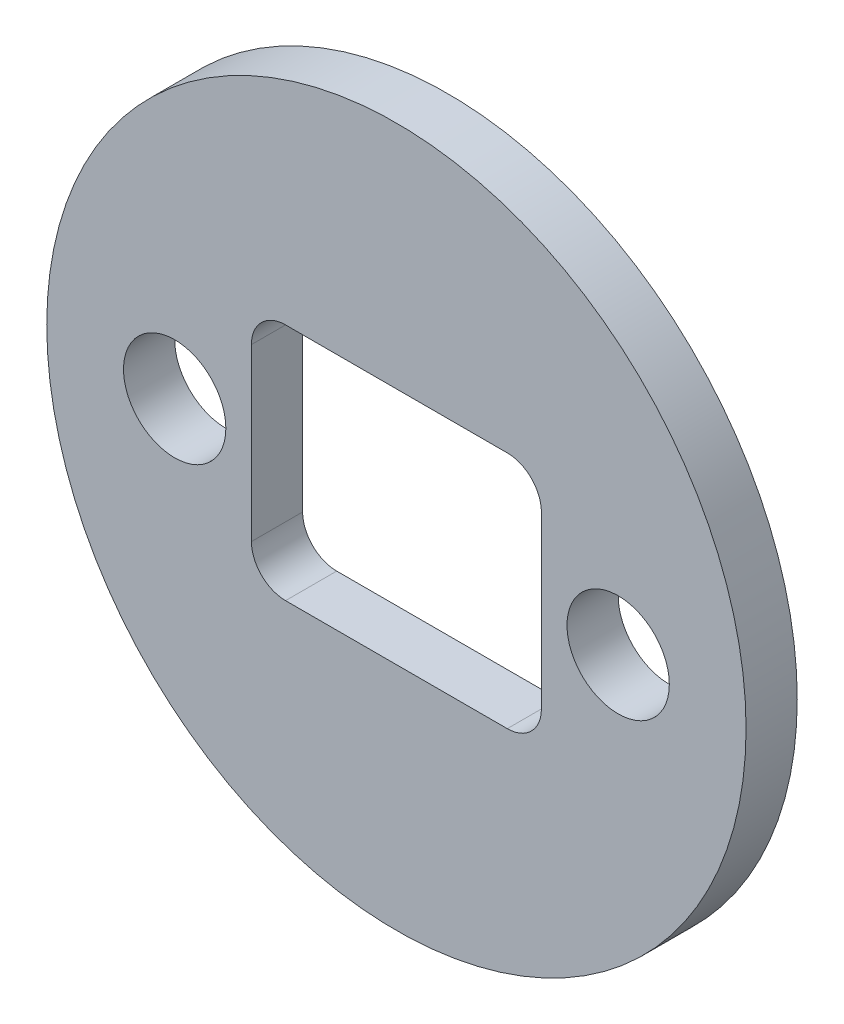
ISO-10303-21;
HEADER;
FILE_DESCRIPTION(('STEP AP214'),'2;1');
FILE_NAME('part.step','',(''),(''),'','','');
FILE_SCHEMA(('AUTOMOTIVE_DESIGN { 1 0 10303 214 1 1 1 1 }'));
ENDSEC;
DATA;
#1=APPLICATION_CONTEXT('core data for automotive mechanical design processes');
#2=APPLICATION_PROTOCOL_DEFINITION('international standard','automotive_design',2000,#1);
#3=PRODUCT_CONTEXT('',#1,'mechanical');
#4=PRODUCT('Part','Part','',(#3));
#5=PRODUCT_RELATED_PRODUCT_CATEGORY('part','',(#4));
#6=PRODUCT_DEFINITION_FORMATION('','',#4);
#7=PRODUCT_DEFINITION_CONTEXT('part definition',#1,'design');
#8=PRODUCT_DEFINITION('design','',#6,#7);
#9=PRODUCT_DEFINITION_SHAPE('','',#8);
#10=(LENGTH_UNIT() NAMED_UNIT(*) SI_UNIT(.MILLI.,.METRE.));
#11=(NAMED_UNIT(*) PLANE_ANGLE_UNIT() SI_UNIT($,.RADIAN.));
#12=(NAMED_UNIT(*) SI_UNIT($,.STERADIAN.) SOLID_ANGLE_UNIT());
#13=UNCERTAINTY_MEASURE_WITH_UNIT(LENGTH_MEASURE(1.E-05),#10,'distance_accuracy_value','');
#14=(GEOMETRIC_REPRESENTATION_CONTEXT(3) GLOBAL_UNCERTAINTY_ASSIGNED_CONTEXT((#13)) GLOBAL_UNIT_ASSIGNED_CONTEXT((#10,
#11,#12)) REPRESENTATION_CONTEXT('',''));
#15=CARTESIAN_POINT('',(0.,0.,0.));
#16=DIRECTION('',(0.,0.,1.));
#17=DIRECTION('',(1.,0.,0.));
#18=AXIS2_PLACEMENT_3D('',#15,#16,#17);
#19=CARTESIAN_POINT('',(0.,0.,3.));
#20=DIRECTION('',(0.,0.,1.));
#21=DIRECTION('',(1.,0.,0.));
#22=AXIS2_PLACEMENT_3D('',#19,#20,#21);
#23=PLANE('',#22);
#24=CARTESIAN_POINT('',(-13.,0.,3.));
#25=DIRECTION('',(0.,0.,1.));
#26=DIRECTION('',(1.,0.,0.));
#27=AXIS2_PLACEMENT_3D('',#24,#25,#26);
#28=CIRCLE('',#27,3.);
#29=CARTESIAN_POINT('',(-10.,0.,3.));
#30=VERTEX_POINT('',#29);
#31=EDGE_CURVE('E181',#30,#30,#28,.T.);
#32=ORIENTED_EDGE('',*,*,#31,.F.);
#33=EDGE_LOOP('',(#32));
#34=FACE_BOUND('',#33,.T.);
#35=CARTESIAN_POINT('',(0.,0.,3.));
#36=DIRECTION('',(0.,0.,1.));
#37=DIRECTION('',(1.,0.,0.));
#38=AXIS2_PLACEMENT_3D('',#35,#36,#37);
#39=CIRCLE('',#38,20.5);
#40=CARTESIAN_POINT('',(20.5,0.,3.));
#41=VERTEX_POINT('',#40);
#42=EDGE_CURVE('E124',#41,#41,#39,.T.);
#43=ORIENTED_EDGE('',*,*,#42,.T.);
#44=EDGE_LOOP('',(#43));
#45=FACE_BOUND('',#44,.T.);
#46=DIRECTION('',(-1.,0.,0.));
#47=VECTOR('',#46,1.);
#48=CARTESIAN_POINT('',(-8.5,7.,3.));
#49=LINE('',#48,#47);
#50=CARTESIAN_POINT('',(6.5,7.,3.));
#51=VERTEX_POINT('',#50);
#52=CARTESIAN_POINT('',(-6.5,7.,3.));
#53=VERTEX_POINT('',#52);
#54=EDGE_CURVE('E165',#51,#53,#49,.T.);
#55=ORIENTED_EDGE('',*,*,#54,.F.);
#56=CARTESIAN_POINT('',(6.5,5.,3.));
#57=DIRECTION('',(0.,0.,1.));
#58=DIRECTION('',(1.,0.,0.));
#59=AXIS2_PLACEMENT_3D('',#56,#57,#58);
#60=CIRCLE('',#59,2.);
#61=CARTESIAN_POINT('',(8.5,5.,3.));
#62=VERTEX_POINT('',#61);
#63=EDGE_CURVE('E11',#51,#62,#60,.F.);
#64=ORIENTED_EDGE('',*,*,#63,.T.);
#65=DIRECTION('',(0.,1.,0.));
#66=VECTOR('',#65,1.);
#67=CARTESIAN_POINT('',(8.5,7.,3.));
#68=LINE('',#67,#66);
#69=CARTESIAN_POINT('',(8.5,-5.,3.));
#70=VERTEX_POINT('',#69);
#71=EDGE_CURVE('E163',#70,#62,#68,.T.);
#72=ORIENTED_EDGE('',*,*,#71,.F.);
#73=CARTESIAN_POINT('',(6.5,-5.,3.));
#74=DIRECTION('',(0.,0.,1.));
#75=DIRECTION('',(1.,0.,0.));
#76=AXIS2_PLACEMENT_3D('',#73,#74,#75);
#77=CIRCLE('',#76,2.);
#78=CARTESIAN_POINT('',(6.5,-7.,3.));
#79=VERTEX_POINT('',#78);
#80=EDGE_CURVE('E112',#70,#79,#77,.F.);
#81=ORIENTED_EDGE('',*,*,#80,.T.);
#82=DIRECTION('',(1.,0.,0.));
#83=VECTOR('',#82,1.);
#84=CARTESIAN_POINT('',(-8.5,-7.,3.));
#85=LINE('',#84,#83);
#86=CARTESIAN_POINT('',(-6.5,-7.,3.));
#87=VERTEX_POINT('',#86);
#88=EDGE_CURVE('E178',#87,#79,#85,.T.);
#89=ORIENTED_EDGE('',*,*,#88,.F.);
#90=CARTESIAN_POINT('',(-6.5,-5.,3.));
#91=DIRECTION('',(0.,0.,1.));
#92=DIRECTION('',(1.,0.,0.));
#93=AXIS2_PLACEMENT_3D('',#90,#91,#92);
#94=CIRCLE('',#93,2.);
#95=CARTESIAN_POINT('',(-8.5,-5.,3.));
#96=VERTEX_POINT('',#95);
#97=EDGE_CURVE('E147',#87,#96,#94,.F.);
#98=ORIENTED_EDGE('',*,*,#97,.T.);
#99=DIRECTION('',(0.,-1.,0.));
#100=VECTOR('',#99,1.);
#101=CARTESIAN_POINT('',(-8.5,7.,3.));
#102=LINE('',#101,#100);
#103=CARTESIAN_POINT('',(-8.5,5.,3.));
#104=VERTEX_POINT('',#103);
#105=EDGE_CURVE('E170',#104,#96,#102,.T.);
#106=ORIENTED_EDGE('',*,*,#105,.F.);
#107=CARTESIAN_POINT('',(-6.5,5.,3.));
#108=DIRECTION('',(0.,0.,1.));
#109=DIRECTION('',(1.,0.,0.));
#110=AXIS2_PLACEMENT_3D('',#107,#108,#109);
#111=CIRCLE('',#110,2.);
#112=EDGE_CURVE('E50',#104,#53,#111,.F.);
#113=ORIENTED_EDGE('',*,*,#112,.T.);
#114=EDGE_LOOP('',(#55,#64,#72,#81,#89,#98,#106,#113));
#115=FACE_BOUND('',#114,.T.);
#116=CARTESIAN_POINT('',(13.,0.,3.));
#117=DIRECTION('',(0.,0.,1.));
#118=DIRECTION('',(1.,0.,0.));
#119=AXIS2_PLACEMENT_3D('',#116,#117,#118);
#120=CIRCLE('',#119,3.);
#121=CARTESIAN_POINT('',(16.,0.,3.));
#122=VERTEX_POINT('',#121);
#123=EDGE_CURVE('E186',#122,#122,#120,.T.);
#124=ORIENTED_EDGE('',*,*,#123,.F.);
#125=EDGE_LOOP('',(#124));
#126=FACE_BOUND('',#125,.T.);
#127=ADVANCED_FACE('F35',(#34,#45,#115,#126),#23,.T.);
#128=CARTESIAN_POINT('',(0.,0.,0.));
#129=DIRECTION('',(0.,0.,1.));
#130=DIRECTION('',(1.,0.,0.));
#131=AXIS2_PLACEMENT_3D('',#128,#129,#130);
#132=PLANE('',#131);
#133=CARTESIAN_POINT('',(-13.,0.,0.));
#134=DIRECTION('',(0.,0.,1.));
#135=DIRECTION('',(1.,0.,0.));
#136=AXIS2_PLACEMENT_3D('',#133,#134,#135);
#137=CIRCLE('',#136,3.);
#138=CARTESIAN_POINT('',(-10.,0.,0.));
#139=VERTEX_POINT('',#138);
#140=EDGE_CURVE('E174',#139,#139,#137,.T.);
#141=ORIENTED_EDGE('',*,*,#140,.T.);
#142=EDGE_LOOP('',(#141));
#143=FACE_BOUND('',#142,.T.);
#144=CARTESIAN_POINT('',(0.,0.,0.));
#145=DIRECTION('',(0.,0.,1.));
#146=DIRECTION('',(1.,0.,0.));
#147=AXIS2_PLACEMENT_3D('',#144,#145,#146);
#148=CIRCLE('',#147,20.5);
#149=CARTESIAN_POINT('',(20.5,0.,0.));
#150=VERTEX_POINT('',#149);
#151=EDGE_CURVE('E129',#150,#150,#148,.T.);
#152=ORIENTED_EDGE('',*,*,#151,.F.);
#153=EDGE_LOOP('',(#152));
#154=FACE_BOUND('',#153,.T.);
#155=DIRECTION('',(1.,0.,0.));
#156=VECTOR('',#155,1.);
#157=CARTESIAN_POINT('',(-8.5,-7.,0.));
#158=LINE('',#157,#156);
#159=CARTESIAN_POINT('',(-6.5,-7.,0.));
#160=VERTEX_POINT('',#159);
#161=CARTESIAN_POINT('',(6.5,-7.,0.));
#162=VERTEX_POINT('',#161);
#163=EDGE_CURVE('E121',#160,#162,#158,.T.);
#164=ORIENTED_EDGE('',*,*,#163,.T.);
#165=CARTESIAN_POINT('',(6.5,-5.,0.));
#166=DIRECTION('',(0.,0.,1.));
#167=DIRECTION('',(1.,0.,0.));
#168=AXIS2_PLACEMENT_3D('',#165,#166,#167);
#169=CIRCLE('',#168,2.);
#170=CARTESIAN_POINT('',(8.5,-5.,0.));
#171=VERTEX_POINT('',#170);
#172=EDGE_CURVE('E149',#162,#171,#169,.T.);
#173=ORIENTED_EDGE('',*,*,#172,.T.);
#174=DIRECTION('',(0.,1.,0.));
#175=VECTOR('',#174,1.);
#176=CARTESIAN_POINT('',(8.5,7.,0.));
#177=LINE('',#176,#175);
#178=CARTESIAN_POINT('',(8.5,5.,0.));
#179=VERTEX_POINT('',#178);
#180=EDGE_CURVE('E154',#171,#179,#177,.T.);
#181=ORIENTED_EDGE('',*,*,#180,.T.);
#182=CARTESIAN_POINT('',(6.5,5.,0.));
#183=DIRECTION('',(0.,0.,1.));
#184=DIRECTION('',(1.,0.,0.));
#185=AXIS2_PLACEMENT_3D('',#182,#183,#184);
#186=CIRCLE('',#185,2.);
#187=CARTESIAN_POINT('',(6.5,7.,0.));
#188=VERTEX_POINT('',#187);
#189=EDGE_CURVE('E43',#179,#188,#186,.T.);
#190=ORIENTED_EDGE('',*,*,#189,.T.);
#191=DIRECTION('',(-1.,0.,0.));
#192=VECTOR('',#191,1.);
#193=CARTESIAN_POINT('',(-8.5,7.,0.));
#194=LINE('',#193,#192);
#195=CARTESIAN_POINT('',(-6.5,7.,0.));
#196=VERTEX_POINT('',#195);
#197=EDGE_CURVE('E107',#188,#196,#194,.T.);
#198=ORIENTED_EDGE('',*,*,#197,.T.);
#199=CARTESIAN_POINT('',(-6.5,5.,0.));
#200=DIRECTION('',(0.,0.,1.));
#201=DIRECTION('',(1.,0.,0.));
#202=AXIS2_PLACEMENT_3D('',#199,#200,#201);
#203=CIRCLE('',#202,2.);
#204=CARTESIAN_POINT('',(-8.5,5.,0.));
#205=VERTEX_POINT('',#204);
#206=EDGE_CURVE('E101',#196,#205,#203,.T.);
#207=ORIENTED_EDGE('',*,*,#206,.T.);
#208=DIRECTION('',(0.,-1.,0.));
#209=VECTOR('',#208,1.);
#210=CARTESIAN_POINT('',(-8.5,7.,0.));
#211=LINE('',#210,#209);
#212=CARTESIAN_POINT('',(-8.5,-5.,0.));
#213=VERTEX_POINT('',#212);
#214=EDGE_CURVE('E106',#205,#213,#211,.T.);
#215=ORIENTED_EDGE('',*,*,#214,.T.);
#216=CARTESIAN_POINT('',(-6.5,-5.,0.));
#217=DIRECTION('',(0.,0.,1.));
#218=DIRECTION('',(1.,0.,0.));
#219=AXIS2_PLACEMENT_3D('',#216,#217,#218);
#220=CIRCLE('',#219,2.);
#221=EDGE_CURVE('E145',#213,#160,#220,.T.);
#222=ORIENTED_EDGE('',*,*,#221,.T.);
#223=EDGE_LOOP('',(#164,#173,#181,#190,#198,#207,#215,#222));
#224=FACE_BOUND('',#223,.T.);
#225=CARTESIAN_POINT('',(13.,0.,0.));
#226=DIRECTION('',(0.,0.,1.));
#227=DIRECTION('',(1.,0.,0.));
#228=AXIS2_PLACEMENT_3D('',#225,#226,#227);
#229=CIRCLE('',#228,3.);
#230=CARTESIAN_POINT('',(16.,0.,0.));
#231=VERTEX_POINT('',#230);
#232=EDGE_CURVE('E188',#231,#231,#229,.T.);
#233=ORIENTED_EDGE('',*,*,#232,.T.);
#234=EDGE_LOOP('',(#233));
#235=FACE_BOUND('',#234,.T.);
#236=ADVANCED_FACE('F104',(#143,#154,#224,#235),#132,.F.);
#237=CARTESIAN_POINT('',(0.,0.,3.));
#238=DIRECTION('',(0.,0.,-1.));
#239=DIRECTION('',(-1.,0.,0.));
#240=AXIS2_PLACEMENT_3D('',#237,#238,#239);
#241=CYLINDRICAL_SURFACE('',#240,20.5);
#242=ORIENTED_EDGE('',*,*,#42,.F.);
#243=EDGE_LOOP('',(#242));
#244=FACE_BOUND('',#243,.T.);
#245=ORIENTED_EDGE('',*,*,#151,.T.);
#246=EDGE_LOOP('',(#245));
#247=FACE_BOUND('',#246,.T.);
#248=ADVANCED_FACE('F202',(#244,#247),#241,.T.);
#249=CARTESIAN_POINT('',(8.5,7.,3.));
#250=DIRECTION('',(-1.,0.,0.));
#251=DIRECTION('',(0.,-1.,0.));
#252=AXIS2_PLACEMENT_3D('',#249,#250,#251);
#253=PLANE('',#252);
#254=ORIENTED_EDGE('',*,*,#180,.F.);
#255=DIRECTION('',(0.,0.,-1.));
#256=VECTOR('',#255,1.);
#257=CARTESIAN_POINT('',(8.5,-5.,3.));
#258=LINE('',#257,#256);
#259=EDGE_CURVE('E140',#171,#70,#258,.F.);
#260=ORIENTED_EDGE('',*,*,#259,.T.);
#261=ORIENTED_EDGE('',*,*,#71,.T.);
#262=DIRECTION('',(0.,0.,-1.));
#263=VECTOR('',#262,1.);
#264=CARTESIAN_POINT('',(8.5,5.,0.));
#265=LINE('',#264,#263);
#266=EDGE_CURVE('E137',#62,#179,#265,.T.);
#267=ORIENTED_EDGE('',*,*,#266,.T.);
#268=EDGE_LOOP('',(#254,#260,#261,#267));
#269=FACE_BOUND('',#268,.T.);
#270=ADVANCED_FACE('F167',(#269),#253,.T.);
#271=CARTESIAN_POINT('',(-8.5,7.,3.));
#272=DIRECTION('',(0.,-1.,0.));
#273=DIRECTION('',(0.,0.,-1.));
#274=AXIS2_PLACEMENT_3D('',#271,#272,#273);
#275=PLANE('',#274);
#276=ORIENTED_EDGE('',*,*,#54,.T.);
#277=DIRECTION('',(0.,0.,-1.));
#278=VECTOR('',#277,1.);
#279=CARTESIAN_POINT('',(-6.5,7.,0.));
#280=LINE('',#279,#278);
#281=EDGE_CURVE('E143',#53,#196,#280,.T.);
#282=ORIENTED_EDGE('',*,*,#281,.T.);
#283=ORIENTED_EDGE('',*,*,#197,.F.);
#284=DIRECTION('',(0.,0.,-1.));
#285=VECTOR('',#284,1.);
#286=CARTESIAN_POINT('',(6.5,7.,3.));
#287=LINE('',#286,#285);
#288=EDGE_CURVE('E57',#188,#51,#287,.F.);
#289=ORIENTED_EDGE('',*,*,#288,.T.);
#290=EDGE_LOOP('',(#276,#282,#283,#289));
#291=FACE_BOUND('',#290,.T.);
#292=ADVANCED_FACE('F157',(#291),#275,.T.);
#293=CARTESIAN_POINT('',(-8.5,7.,3.));
#294=DIRECTION('',(1.,0.,0.));
#295=DIRECTION('',(0.,1.,0.));
#296=AXIS2_PLACEMENT_3D('',#293,#294,#295);
#297=PLANE('',#296);
#298=ORIENTED_EDGE('',*,*,#105,.T.);
#299=DIRECTION('',(0.,0.,-1.));
#300=VECTOR('',#299,1.);
#301=CARTESIAN_POINT('',(-8.5,-5.,0.));
#302=LINE('',#301,#300);
#303=EDGE_CURVE('E120',#96,#213,#302,.T.);
#304=ORIENTED_EDGE('',*,*,#303,.T.);
#305=ORIENTED_EDGE('',*,*,#214,.F.);
#306=DIRECTION('',(0.,0.,-1.));
#307=VECTOR('',#306,1.);
#308=CARTESIAN_POINT('',(-8.5,5.,3.));
#309=LINE('',#308,#307);
#310=EDGE_CURVE('E118',#205,#104,#309,.F.);
#311=ORIENTED_EDGE('',*,*,#310,.T.);
#312=EDGE_LOOP('',(#298,#304,#305,#311));
#313=FACE_BOUND('',#312,.T.);
#314=ADVANCED_FACE('F117',(#313),#297,.T.);
#315=CARTESIAN_POINT('',(-8.5,-7.,3.));
#316=DIRECTION('',(0.,1.,0.));
#317=DIRECTION('',(0.,0.,1.));
#318=AXIS2_PLACEMENT_3D('',#315,#316,#317);
#319=PLANE('',#318);
#320=ORIENTED_EDGE('',*,*,#163,.F.);
#321=DIRECTION('',(0.,0.,-1.));
#322=VECTOR('',#321,1.);
#323=CARTESIAN_POINT('',(-6.5,-7.,3.));
#324=LINE('',#323,#322);
#325=EDGE_CURVE('E135',#160,#87,#324,.F.);
#326=ORIENTED_EDGE('',*,*,#325,.T.);
#327=ORIENTED_EDGE('',*,*,#88,.T.);
#328=DIRECTION('',(0.,0.,-1.));
#329=VECTOR('',#328,1.);
#330=CARTESIAN_POINT('',(6.5,-7.,0.));
#331=LINE('',#330,#329);
#332=EDGE_CURVE('E126',#79,#162,#331,.T.);
#333=ORIENTED_EDGE('',*,*,#332,.T.);
#334=EDGE_LOOP('',(#320,#326,#327,#333));
#335=FACE_BOUND('',#334,.T.);
#336=ADVANCED_FACE('F248',(#335),#319,.T.);
#337=CARTESIAN_POINT('',(-13.,0.,3.));
#338=DIRECTION('',(0.,0.,-1.));
#339=DIRECTION('',(-1.,0.,0.));
#340=AXIS2_PLACEMENT_3D('',#337,#338,#339);
#341=CYLINDRICAL_SURFACE('',#340,3.);
#342=ORIENTED_EDGE('',*,*,#31,.T.);
#343=EDGE_LOOP('',(#342));
#344=FACE_BOUND('',#343,.T.);
#345=ORIENTED_EDGE('',*,*,#140,.F.);
#346=EDGE_LOOP('',(#345));
#347=FACE_BOUND('',#346,.T.);
#348=ADVANCED_FACE('F253',(#344,#347),#341,.F.);
#349=CARTESIAN_POINT('',(13.,0.,3.));
#350=DIRECTION('',(0.,0.,-1.));
#351=DIRECTION('',(-1.,0.,0.));
#352=AXIS2_PLACEMENT_3D('',#349,#350,#351);
#353=CYLINDRICAL_SURFACE('',#352,3.);
#354=ORIENTED_EDGE('',*,*,#123,.T.);
#355=EDGE_LOOP('',(#354));
#356=FACE_BOUND('',#355,.T.);
#357=ORIENTED_EDGE('',*,*,#232,.F.);
#358=EDGE_LOOP('',(#357));
#359=FACE_BOUND('',#358,.T.);
#360=ADVANCED_FACE('F194',(#356,#359),#353,.F.);
#361=CARTESIAN_POINT('',(-6.5,-5.,3.));
#362=DIRECTION('',(0.,0.,1.));
#363=DIRECTION('',(1.,0.,0.));
#364=AXIS2_PLACEMENT_3D('',#361,#362,#363);
#365=CYLINDRICAL_SURFACE('',#364,2.);
#366=ORIENTED_EDGE('',*,*,#97,.F.);
#367=ORIENTED_EDGE('',*,*,#325,.F.);
#368=ORIENTED_EDGE('',*,*,#221,.F.);
#369=ORIENTED_EDGE('',*,*,#303,.F.);
#370=EDGE_LOOP('',(#366,#367,#368,#369));
#371=FACE_BOUND('',#370,.T.);
#372=ADVANCED_FACE('F212',(#371),#365,.F.);
#373=CARTESIAN_POINT('',(6.5,-5.,3.));
#374=DIRECTION('',(0.,0.,1.));
#375=DIRECTION('',(1.,0.,0.));
#376=AXIS2_PLACEMENT_3D('',#373,#374,#375);
#377=CYLINDRICAL_SURFACE('',#376,2.);
#378=ORIENTED_EDGE('',*,*,#80,.F.);
#379=ORIENTED_EDGE('',*,*,#259,.F.);
#380=ORIENTED_EDGE('',*,*,#172,.F.);
#381=ORIENTED_EDGE('',*,*,#332,.F.);
#382=EDGE_LOOP('',(#378,#379,#380,#381));
#383=FACE_BOUND('',#382,.T.);
#384=ADVANCED_FACE('F215',(#383),#377,.F.);
#385=CARTESIAN_POINT('',(-6.5,5.,3.));
#386=DIRECTION('',(0.,0.,1.));
#387=DIRECTION('',(1.,0.,0.));
#388=AXIS2_PLACEMENT_3D('',#385,#386,#387);
#389=CYLINDRICAL_SURFACE('',#388,2.);
#390=ORIENTED_EDGE('',*,*,#112,.F.);
#391=ORIENTED_EDGE('',*,*,#310,.F.);
#392=ORIENTED_EDGE('',*,*,#206,.F.);
#393=ORIENTED_EDGE('',*,*,#281,.F.);
#394=EDGE_LOOP('',(#390,#391,#392,#393));
#395=FACE_BOUND('',#394,.T.);
#396=ADVANCED_FACE('F123',(#395),#389,.F.);
#397=CARTESIAN_POINT('',(6.5,5.,3.));
#398=DIRECTION('',(0.,0.,1.));
#399=DIRECTION('',(1.,0.,0.));
#400=AXIS2_PLACEMENT_3D('',#397,#398,#399);
#401=CYLINDRICAL_SURFACE('',#400,2.);
#402=ORIENTED_EDGE('',*,*,#63,.F.);
#403=ORIENTED_EDGE('',*,*,#288,.F.);
#404=ORIENTED_EDGE('',*,*,#189,.F.);
#405=ORIENTED_EDGE('',*,*,#266,.F.);
#406=EDGE_LOOP('',(#402,#403,#404,#405));
#407=FACE_BOUND('',#406,.T.);
#408=ADVANCED_FACE('F37',(#407),#401,.F.);
#409=CLOSED_SHELL('',(#127,#236,#248,#270,#292,#314,#336,#348,#360,#372,#384,#396,#408));
#410=MANIFOLD_SOLID_BREP('B2',#409);
#411=ADVANCED_BREP_SHAPE_REPRESENTATION('',(#18,#410),#14);
#412=SHAPE_DEFINITION_REPRESENTATION(#9,#411);
ENDSEC;
END-ISO-10303-21;
